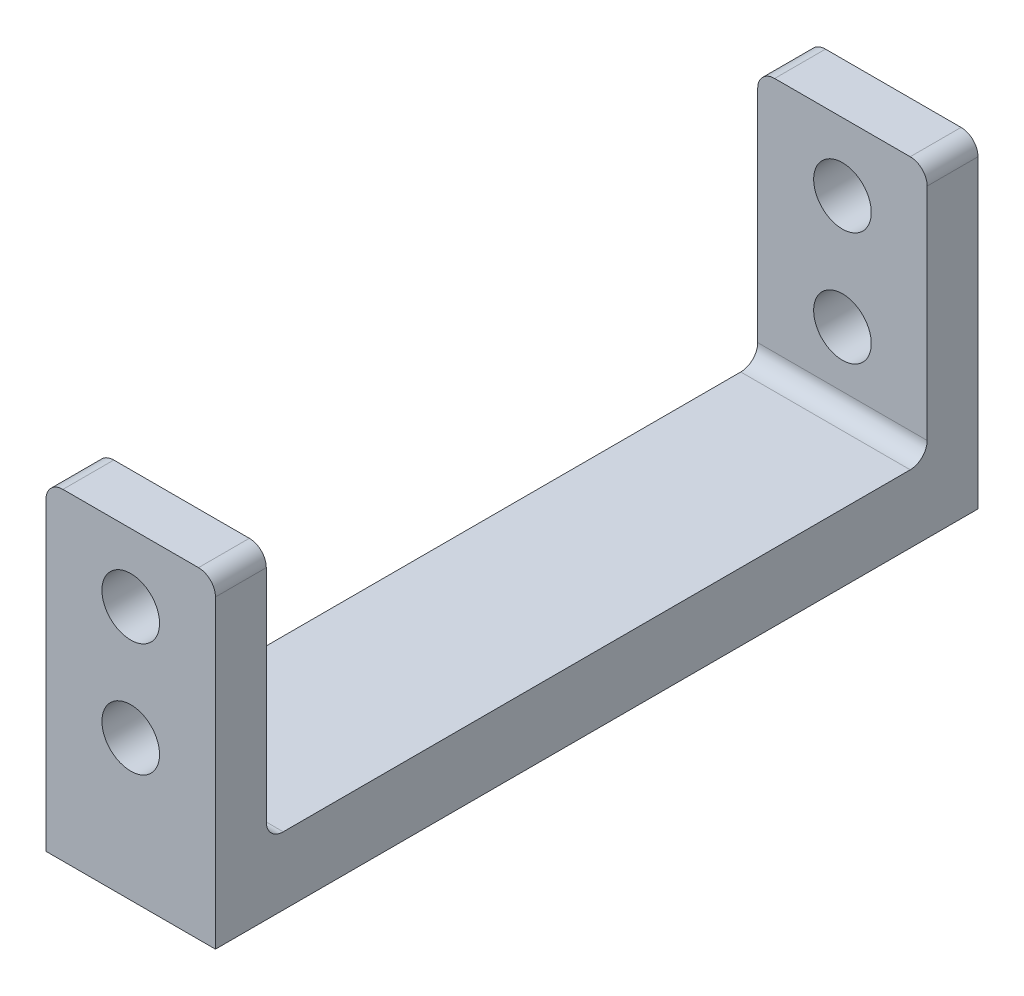
ISO-10303-21;
HEADER;
FILE_DESCRIPTION(('STEP AP214'),'2;1');
FILE_NAME('part.step','',(''),(''),'','','');
FILE_SCHEMA(('AUTOMOTIVE_DESIGN { 1 0 10303 214 1 1 1 1 }'));
ENDSEC;
DATA;
#1=APPLICATION_CONTEXT('core data for automotive mechanical design processes');
#2=APPLICATION_PROTOCOL_DEFINITION('international standard','automotive_design',2000,#1);
#3=PRODUCT_CONTEXT('',#1,'mechanical');
#4=PRODUCT('Part','Part','',(#3));
#5=PRODUCT_RELATED_PRODUCT_CATEGORY('part','',(#4));
#6=PRODUCT_DEFINITION_FORMATION('','',#4);
#7=PRODUCT_DEFINITION_CONTEXT('part definition',#1,'design');
#8=PRODUCT_DEFINITION('design','',#6,#7);
#9=PRODUCT_DEFINITION_SHAPE('','',#8);
#10=(LENGTH_UNIT() NAMED_UNIT(*) SI_UNIT(.MILLI.,.METRE.));
#11=(NAMED_UNIT(*) PLANE_ANGLE_UNIT() SI_UNIT($,.RADIAN.));
#12=(NAMED_UNIT(*) SI_UNIT($,.STERADIAN.) SOLID_ANGLE_UNIT());
#13=UNCERTAINTY_MEASURE_WITH_UNIT(LENGTH_MEASURE(1.E-05),#10,'distance_accuracy_value','');
#14=(GEOMETRIC_REPRESENTATION_CONTEXT(3) GLOBAL_UNCERTAINTY_ASSIGNED_CONTEXT((#13)) GLOBAL_UNIT_ASSIGNED_CONTEXT((#10,
#11,#12)) REPRESENTATION_CONTEXT('',''));
#15=CARTESIAN_POINT('',(0.,0.,0.));
#16=DIRECTION('',(0.,0.,1.));
#17=DIRECTION('',(1.,0.,0.));
#18=AXIS2_PLACEMENT_3D('',#15,#16,#17);
#19=CARTESIAN_POINT('',(5.,4.,22.5));
#20=DIRECTION('',(0.,0.,-1.));
#21=DIRECTION('',(-1.,0.,0.));
#22=AXIS2_PLACEMENT_3D('',#19,#20,#21);
#23=PLANE('',#22);
#24=CARTESIAN_POINT('',(0.,8.3,22.5));
#25=DIRECTION('',(0.,0.,1.));
#26=DIRECTION('',(1.,0.,0.));
#27=AXIS2_PLACEMENT_3D('',#24,#25,#26);
#28=CIRCLE('',#27,1.7);
#29=CARTESIAN_POINT('',(1.7,8.3,22.5));
#30=VERTEX_POINT('',#29);
#31=EDGE_CURVE('E542',#30,#30,#28,.T.);
#32=ORIENTED_EDGE('',*,*,#31,.F.);
#33=EDGE_LOOP('',(#32));
#34=FACE_BOUND('',#33,.T.);
#35=DIRECTION('',(0.,-1.,0.));
#36=VECTOR('',#35,1.);
#37=CARTESIAN_POINT('',(5.,4.,22.5));
#38=LINE('',#37,#36);
#39=CARTESIAN_POINT('',(5.,18.,22.5));
#40=VERTEX_POINT('',#39);
#41=CARTESIAN_POINT('',(5.,0.,22.5));
#42=VERTEX_POINT('',#41);
#43=EDGE_CURVE('E162',#40,#42,#38,.T.);
#44=ORIENTED_EDGE('',*,*,#43,.F.);
#45=CARTESIAN_POINT('',(4.,18.,22.5));
#46=DIRECTION('',(0.,0.,-1.));
#47=DIRECTION('',(-1.,0.,0.));
#48=AXIS2_PLACEMENT_3D('',#45,#46,#47);
#49=CIRCLE('',#48,1.);
#50=CARTESIAN_POINT('',(4.,19.,22.5));
#51=VERTEX_POINT('',#50);
#52=EDGE_CURVE('E241',#40,#51,#49,.F.);
#53=ORIENTED_EDGE('',*,*,#52,.T.);
#54=DIRECTION('',(1.,0.,0.));
#55=VECTOR('',#54,1.);
#56=CARTESIAN_POINT('',(-5.,19.,22.5));
#57=LINE('',#56,#55);
#58=CARTESIAN_POINT('',(-4.,19.,22.5));
#59=VERTEX_POINT('',#58);
#60=EDGE_CURVE('E303',#59,#51,#57,.T.);
#61=ORIENTED_EDGE('',*,*,#60,.F.);
#62=CARTESIAN_POINT('',(-4.,18.,22.5));
#63=DIRECTION('',(0.,0.,-1.));
#64=DIRECTION('',(-1.,0.,0.));
#65=AXIS2_PLACEMENT_3D('',#62,#63,#64);
#66=CIRCLE('',#65,1.);
#67=CARTESIAN_POINT('',(-5.,18.,22.5));
#68=VERTEX_POINT('',#67);
#69=EDGE_CURVE('E156',#59,#68,#66,.F.);
#70=ORIENTED_EDGE('',*,*,#69,.T.);
#71=DIRECTION('',(0.,-1.,0.));
#72=VECTOR('',#71,1.);
#73=CARTESIAN_POINT('',(-5.,4.,22.5));
#74=LINE('',#73,#72);
#75=CARTESIAN_POINT('',(-5.,0.,22.5));
#76=VERTEX_POINT('',#75);
#77=EDGE_CURVE('E149',#68,#76,#74,.T.);
#78=ORIENTED_EDGE('',*,*,#77,.T.);
#79=DIRECTION('',(1.,0.,0.));
#80=VECTOR('',#79,1.);
#81=CARTESIAN_POINT('',(5.,0.,22.5));
#82=LINE('',#81,#80);
#83=EDGE_CURVE('E153',#76,#42,#82,.T.);
#84=ORIENTED_EDGE('',*,*,#83,.T.);
#85=EDGE_LOOP('',(#44,#53,#61,#70,#78,#84));
#86=FACE_BOUND('',#85,.T.);
#87=CARTESIAN_POINT('',(0.,15.,22.5));
#88=DIRECTION('',(0.,0.,1.));
#89=DIRECTION('',(1.,0.,0.));
#90=AXIS2_PLACEMENT_3D('',#87,#88,#89);
#91=CIRCLE('',#90,1.7);
#92=CARTESIAN_POINT('',(1.7,15.,22.5));
#93=VERTEX_POINT('',#92);
#94=EDGE_CURVE('E549',#93,#93,#91,.T.);
#95=ORIENTED_EDGE('',*,*,#94,.F.);
#96=EDGE_LOOP('',(#95));
#97=FACE_BOUND('',#96,.T.);
#98=ADVANCED_FACE('F45',(#34,#86,#97),#23,.F.);
#99=CARTESIAN_POINT('',(0.,4.,0.));
#100=DIRECTION('',(0.,-1.,0.));
#101=DIRECTION('',(0.,0.,-1.));
#102=AXIS2_PLACEMENT_3D('',#99,#100,#101);
#103=PLANE('',#102);
#104=DIRECTION('',(0.,0.,1.));
#105=VECTOR('',#104,1.);
#106=CARTESIAN_POINT('',(-5.,4.,-22.5));
#107=LINE('',#106,#105);
#108=CARTESIAN_POINT('',(-5.,4.,-18.5));
#109=VERTEX_POINT('',#108);
#110=CARTESIAN_POINT('',(-5.,4.,18.5));
#111=VERTEX_POINT('',#110);
#112=EDGE_CURVE('E192',#109,#111,#107,.T.);
#113=ORIENTED_EDGE('',*,*,#112,.T.);
#114=DIRECTION('',(-1.,0.,0.));
#115=VECTOR('',#114,1.);
#116=CARTESIAN_POINT('',(5.,4.,18.5));
#117=LINE('',#116,#115);
#118=CARTESIAN_POINT('',(5.,4.,18.5));
#119=VERTEX_POINT('',#118);
#120=EDGE_CURVE('E212',#111,#119,#117,.F.);
#121=ORIENTED_EDGE('',*,*,#120,.T.);
#122=DIRECTION('',(0.,0.,-1.));
#123=VECTOR('',#122,1.);
#124=CARTESIAN_POINT('',(5.,4.,-22.5));
#125=LINE('',#124,#123);
#126=CARTESIAN_POINT('',(5.,4.,-18.5));
#127=VERTEX_POINT('',#126);
#128=EDGE_CURVE('E184',#119,#127,#125,.T.);
#129=ORIENTED_EDGE('',*,*,#128,.T.);
#130=DIRECTION('',(1.,0.,0.));
#131=VECTOR('',#130,1.);
#132=CARTESIAN_POINT('',(-5.,4.,-18.5));
#133=LINE('',#132,#131);
#134=EDGE_CURVE('E209',#127,#109,#133,.F.);
#135=ORIENTED_EDGE('',*,*,#134,.T.);
#136=EDGE_LOOP('',(#113,#121,#129,#135));
#137=FACE_BOUND('',#136,.T.);
#138=ADVANCED_FACE('F280',(#137),#103,.F.);
#139=CARTESIAN_POINT('',(-5.,4.,-22.5));
#140=DIRECTION('',(1.,0.,0.));
#141=DIRECTION('',(0.,0.,-1.));
#142=AXIS2_PLACEMENT_3D('',#139,#140,#141);
#143=PLANE('',#142);
#144=ORIENTED_EDGE('',*,*,#77,.F.);
#145=DIRECTION('',(0.,0.,1.));
#146=VECTOR('',#145,1.);
#147=CARTESIAN_POINT('',(-5.,18.,19.5));
#148=LINE('',#147,#146);
#149=CARTESIAN_POINT('',(-5.,18.,19.5));
#150=VERTEX_POINT('',#149);
#151=EDGE_CURVE('E247',#68,#150,#148,.F.);
#152=ORIENTED_EDGE('',*,*,#151,.T.);
#153=DIRECTION('',(0.,-1.,0.));
#154=VECTOR('',#153,1.);
#155=CARTESIAN_POINT('',(-5.,19.,19.5));
#156=LINE('',#155,#154);
#157=CARTESIAN_POINT('',(-5.,5.,19.5));
#158=VERTEX_POINT('',#157);
#159=EDGE_CURVE('E311',#150,#158,#156,.T.);
#160=ORIENTED_EDGE('',*,*,#159,.T.);
#161=CARTESIAN_POINT('',(-5.,5.,18.5));
#162=DIRECTION('',(1.,0.,0.));
#163=DIRECTION('',(0.,0.,-1.));
#164=AXIS2_PLACEMENT_3D('',#161,#162,#163);
#165=CIRCLE('',#164,1.);
#166=EDGE_CURVE('E261',#158,#111,#165,.T.);
#167=ORIENTED_EDGE('',*,*,#166,.T.);
#168=ORIENTED_EDGE('',*,*,#112,.F.);
#169=CARTESIAN_POINT('',(-5.,5.,-18.5));
#170=DIRECTION('',(1.,0.,0.));
#171=DIRECTION('',(0.,0.,-1.));
#172=AXIS2_PLACEMENT_3D('',#169,#170,#171);
#173=CIRCLE('',#172,1.);
#174=CARTESIAN_POINT('',(-5.,5.,-19.5));
#175=VERTEX_POINT('',#174);
#176=EDGE_CURVE('E11',#109,#175,#173,.T.);
#177=ORIENTED_EDGE('',*,*,#176,.T.);
#178=DIRECTION('',(0.,-1.,0.));
#179=VECTOR('',#178,1.);
#180=CARTESIAN_POINT('',(-5.,19.,-19.5));
#181=LINE('',#180,#179);
#182=CARTESIAN_POINT('',(-5.,18.,-19.5));
#183=VERTEX_POINT('',#182);
#184=EDGE_CURVE('E177',#183,#175,#181,.T.);
#185=ORIENTED_EDGE('',*,*,#184,.F.);
#186=DIRECTION('',(0.,0.,1.));
#187=VECTOR('',#186,1.);
#188=CARTESIAN_POINT('',(-5.,18.,-22.5));
#189=LINE('',#188,#187);
#190=CARTESIAN_POINT('',(-5.,18.,-22.5));
#191=VERTEX_POINT('',#190);
#192=EDGE_CURVE('E244',#183,#191,#189,.F.);
#193=ORIENTED_EDGE('',*,*,#192,.T.);
#194=DIRECTION('',(0.,-1.,0.));
#195=VECTOR('',#194,1.);
#196=CARTESIAN_POINT('',(-5.,4.,-22.5));
#197=LINE('',#196,#195);
#198=CARTESIAN_POINT('',(-5.,0.,-22.5));
#199=VERTEX_POINT('',#198);
#200=EDGE_CURVE('E174',#191,#199,#197,.T.);
#201=ORIENTED_EDGE('',*,*,#200,.T.);
#202=DIRECTION('',(0.,0.,1.));
#203=VECTOR('',#202,1.);
#204=CARTESIAN_POINT('',(-5.,0.,-22.5));
#205=LINE('',#204,#203);
#206=EDGE_CURVE('E168',#199,#76,#205,.T.);
#207=ORIENTED_EDGE('',*,*,#206,.T.);
#208=EDGE_LOOP('',(#144,#152,#160,#167,#168,#177,#185,#193,#201,#207));
#209=FACE_BOUND('',#208,.T.);
#210=ADVANCED_FACE('F173',(#209),#143,.F.);
#211=CARTESIAN_POINT('',(5.,4.,-22.5));
#212=DIRECTION('',(-1.,0.,0.));
#213=DIRECTION('',(0.,0.,1.));
#214=AXIS2_PLACEMENT_3D('',#211,#212,#213);
#215=PLANE('',#214);
#216=DIRECTION('',(0.,-1.,0.));
#217=VECTOR('',#216,1.);
#218=CARTESIAN_POINT('',(5.,19.,19.5));
#219=LINE('',#218,#217);
#220=CARTESIAN_POINT('',(5.,18.,19.5));
#221=VERTEX_POINT('',#220);
#222=CARTESIAN_POINT('',(5.,5.,19.5));
#223=VERTEX_POINT('',#222);
#224=EDGE_CURVE('E307',#221,#223,#219,.T.);
#225=ORIENTED_EDGE('',*,*,#224,.F.);
#226=DIRECTION('',(0.,0.,-1.));
#227=VECTOR('',#226,1.);
#228=CARTESIAN_POINT('',(5.,18.,22.5));
#229=LINE('',#228,#227);
#230=EDGE_CURVE('E236',#221,#40,#229,.F.);
#231=ORIENTED_EDGE('',*,*,#230,.T.);
#232=ORIENTED_EDGE('',*,*,#43,.T.);
#233=DIRECTION('',(0.,0.,-1.));
#234=VECTOR('',#233,1.);
#235=CARTESIAN_POINT('',(5.,0.,-22.5));
#236=LINE('',#235,#234);
#237=CARTESIAN_POINT('',(5.,0.,-22.5));
#238=VERTEX_POINT('',#237);
#239=EDGE_CURVE('E170',#42,#238,#236,.T.);
#240=ORIENTED_EDGE('',*,*,#239,.T.);
#241=DIRECTION('',(0.,-1.,0.));
#242=VECTOR('',#241,1.);
#243=CARTESIAN_POINT('',(5.,4.,-22.5));
#244=LINE('',#243,#242);
#245=CARTESIAN_POINT('',(5.,18.,-22.5));
#246=VERTEX_POINT('',#245);
#247=EDGE_CURVE('E195',#246,#238,#244,.T.);
#248=ORIENTED_EDGE('',*,*,#247,.F.);
#249=DIRECTION('',(0.,0.,-1.));
#250=VECTOR('',#249,1.);
#251=CARTESIAN_POINT('',(5.,18.,-19.5));
#252=LINE('',#251,#250);
#253=CARTESIAN_POINT('',(5.,18.,-19.5));
#254=VERTEX_POINT('',#253);
#255=EDGE_CURVE('E233',#246,#254,#252,.F.);
#256=ORIENTED_EDGE('',*,*,#255,.T.);
#257=DIRECTION('',(0.,-1.,0.));
#258=VECTOR('',#257,1.);
#259=CARTESIAN_POINT('',(5.,19.,-19.5));
#260=LINE('',#259,#258);
#261=CARTESIAN_POINT('',(5.,5.,-19.5));
#262=VERTEX_POINT('',#261);
#263=EDGE_CURVE('E181',#254,#262,#260,.T.);
#264=ORIENTED_EDGE('',*,*,#263,.T.);
#265=CARTESIAN_POINT('',(5.,5.,-18.5));
#266=DIRECTION('',(-1.,0.,0.));
#267=DIRECTION('',(0.,0.,1.));
#268=AXIS2_PLACEMENT_3D('',#265,#266,#267);
#269=CIRCLE('',#268,1.);
#270=EDGE_CURVE('E54',#262,#127,#269,.T.);
#271=ORIENTED_EDGE('',*,*,#270,.T.);
#272=ORIENTED_EDGE('',*,*,#128,.F.);
#273=CARTESIAN_POINT('',(5.,5.,18.5));
#274=DIRECTION('',(-1.,0.,0.));
#275=DIRECTION('',(0.,0.,1.));
#276=AXIS2_PLACEMENT_3D('',#273,#274,#275);
#277=CIRCLE('',#276,1.);
#278=EDGE_CURVE('E264',#119,#223,#277,.T.);
#279=ORIENTED_EDGE('',*,*,#278,.T.);
#280=EDGE_LOOP('',(#225,#231,#232,#240,#248,#256,#264,#271,#272,#279));
#281=FACE_BOUND('',#280,.T.);
#282=ADVANCED_FACE('F272',(#281),#215,.F.);
#283=CARTESIAN_POINT('',(5.,4.,-22.5));
#284=DIRECTION('',(0.,0.,1.));
#285=DIRECTION('',(1.,0.,0.));
#286=AXIS2_PLACEMENT_3D('',#283,#284,#285);
#287=PLANE('',#286);
#288=CARTESIAN_POINT('',(0.,15.,-22.5));
#289=DIRECTION('',(0.,0.,-1.));
#290=DIRECTION('',(-1.,0.,0.));
#291=AXIS2_PLACEMENT_3D('',#288,#289,#290);
#292=CIRCLE('',#291,1.7);
#293=CARTESIAN_POINT('',(-1.7,15.,-22.5));
#294=VERTEX_POINT('',#293);
#295=EDGE_CURVE('E565',#294,#294,#292,.T.);
#296=ORIENTED_EDGE('',*,*,#295,.F.);
#297=EDGE_LOOP('',(#296));
#298=FACE_BOUND('',#297,.T.);
#299=CARTESIAN_POINT('',(0.,8.3,-22.5));
#300=DIRECTION('',(0.,0.,-1.));
#301=DIRECTION('',(-1.,0.,0.));
#302=AXIS2_PLACEMENT_3D('',#299,#300,#301);
#303=CIRCLE('',#302,1.7);
#304=CARTESIAN_POINT('',(-1.7,8.3,-22.5));
#305=VERTEX_POINT('',#304);
#306=EDGE_CURVE('E557',#305,#305,#303,.T.);
#307=ORIENTED_EDGE('',*,*,#306,.F.);
#308=EDGE_LOOP('',(#307));
#309=FACE_BOUND('',#308,.T.);
#310=DIRECTION('',(-1.,0.,0.));
#311=VECTOR('',#310,1.);
#312=CARTESIAN_POINT('',(-5.,19.,-22.5));
#313=LINE('',#312,#311);
#314=CARTESIAN_POINT('',(4.,19.,-22.5));
#315=VERTEX_POINT('',#314);
#316=CARTESIAN_POINT('',(-4.,19.,-22.5));
#317=VERTEX_POINT('',#316);
#318=EDGE_CURVE('E297',#315,#317,#313,.T.);
#319=ORIENTED_EDGE('',*,*,#318,.F.);
#320=CARTESIAN_POINT('',(4.,18.,-22.5));
#321=DIRECTION('',(0.,0.,1.));
#322=DIRECTION('',(1.,0.,0.));
#323=AXIS2_PLACEMENT_3D('',#320,#321,#322);
#324=CIRCLE('',#323,1.);
#325=EDGE_CURVE('E69',#315,#246,#324,.F.);
#326=ORIENTED_EDGE('',*,*,#325,.T.);
#327=ORIENTED_EDGE('',*,*,#247,.T.);
#328=DIRECTION('',(-1.,0.,0.));
#329=VECTOR('',#328,1.);
#330=CARTESIAN_POINT('',(5.,0.,-22.5));
#331=LINE('',#330,#329);
#332=EDGE_CURVE('E189',#238,#199,#331,.T.);
#333=ORIENTED_EDGE('',*,*,#332,.T.);
#334=ORIENTED_EDGE('',*,*,#200,.F.);
#335=CARTESIAN_POINT('',(-4.,18.,-22.5));
#336=DIRECTION('',(0.,0.,1.));
#337=DIRECTION('',(1.,0.,0.));
#338=AXIS2_PLACEMENT_3D('',#335,#336,#337);
#339=CIRCLE('',#338,1.);
#340=EDGE_CURVE('E61',#191,#317,#339,.F.);
#341=ORIENTED_EDGE('',*,*,#340,.T.);
#342=EDGE_LOOP('',(#319,#326,#327,#333,#334,#341));
#343=FACE_BOUND('',#342,.T.);
#344=ADVANCED_FACE('F339',(#298,#309,#343),#287,.F.);
#345=CARTESIAN_POINT('',(0.,0.,0.));
#346=DIRECTION('',(0.,-1.,0.));
#347=DIRECTION('',(0.,0.,-1.));
#348=AXIS2_PLACEMENT_3D('',#345,#346,#347);
#349=PLANE('',#348);
#350=ORIENTED_EDGE('',*,*,#206,.F.);
#351=ORIENTED_EDGE('',*,*,#332,.F.);
#352=ORIENTED_EDGE('',*,*,#239,.F.);
#353=ORIENTED_EDGE('',*,*,#83,.F.);
#354=EDGE_LOOP('',(#350,#351,#352,#353));
#355=FACE_BOUND('',#354,.T.);
#356=ADVANCED_FACE('F166',(#355),#349,.T.);
#357=CARTESIAN_POINT('',(-5.,19.,19.5));
#358=DIRECTION('',(0.,0.,1.));
#359=DIRECTION('',(1.,0.,0.));
#360=AXIS2_PLACEMENT_3D('',#357,#358,#359);
#361=PLANE('',#360);
#362=CARTESIAN_POINT('',(0.,15.,19.5));
#363=DIRECTION('',(0.,0.,1.));
#364=DIRECTION('',(1.,0.,0.));
#365=AXIS2_PLACEMENT_3D('',#362,#363,#364);
#366=CIRCLE('',#365,1.7);
#367=CARTESIAN_POINT('',(1.7,15.,19.5));
#368=VERTEX_POINT('',#367);
#369=EDGE_CURVE('E538',#368,#368,#366,.T.);
#370=ORIENTED_EDGE('',*,*,#369,.T.);
#371=EDGE_LOOP('',(#370));
#372=FACE_BOUND('',#371,.T.);
#373=CARTESIAN_POINT('',(0.,8.3,19.5));
#374=DIRECTION('',(0.,0.,1.));
#375=DIRECTION('',(1.,0.,0.));
#376=AXIS2_PLACEMENT_3D('',#373,#374,#375);
#377=CIRCLE('',#376,1.7);
#378=CARTESIAN_POINT('',(1.7,8.3,19.5));
#379=VERTEX_POINT('',#378);
#380=EDGE_CURVE('E312',#379,#379,#377,.T.);
#381=ORIENTED_EDGE('',*,*,#380,.T.);
#382=EDGE_LOOP('',(#381));
#383=FACE_BOUND('',#382,.T.);
#384=ORIENTED_EDGE('',*,*,#224,.T.);
#385=DIRECTION('',(-1.,0.,0.));
#386=VECTOR('',#385,1.);
#387=CARTESIAN_POINT('',(-5.,5.,19.5));
#388=LINE('',#387,#386);
#389=EDGE_CURVE('E205',#223,#158,#388,.T.);
#390=ORIENTED_EDGE('',*,*,#389,.T.);
#391=ORIENTED_EDGE('',*,*,#159,.F.);
#392=CARTESIAN_POINT('',(-4.,18.,19.5));
#393=DIRECTION('',(0.,0.,1.));
#394=DIRECTION('',(1.,0.,0.));
#395=AXIS2_PLACEMENT_3D('',#392,#393,#394);
#396=CIRCLE('',#395,1.);
#397=CARTESIAN_POINT('',(-4.,19.,19.5));
#398=VERTEX_POINT('',#397);
#399=EDGE_CURVE('E161',#150,#398,#396,.F.);
#400=ORIENTED_EDGE('',*,*,#399,.T.);
#401=DIRECTION('',(-1.,0.,0.));
#402=VECTOR('',#401,1.);
#403=CARTESIAN_POINT('',(-5.,19.,19.5));
#404=LINE('',#403,#402);
#405=CARTESIAN_POINT('',(4.,19.,19.5));
#406=VERTEX_POINT('',#405);
#407=EDGE_CURVE('E316',#406,#398,#404,.T.);
#408=ORIENTED_EDGE('',*,*,#407,.F.);
#409=CARTESIAN_POINT('',(4.,18.,19.5));
#410=DIRECTION('',(0.,0.,1.));
#411=DIRECTION('',(1.,0.,0.));
#412=AXIS2_PLACEMENT_3D('',#409,#410,#411);
#413=CIRCLE('',#412,1.);
#414=EDGE_CURVE('E202',#406,#221,#413,.F.);
#415=ORIENTED_EDGE('',*,*,#414,.T.);
#416=EDGE_LOOP('',(#384,#390,#391,#400,#408,#415));
#417=FACE_BOUND('',#416,.T.);
#418=ADVANCED_FACE('F328',(#372,#383,#417),#361,.F.);
#419=CARTESIAN_POINT('',(0.,19.,0.));
#420=DIRECTION('',(0.,1.,0.));
#421=DIRECTION('',(0.,0.,1.));
#422=AXIS2_PLACEMENT_3D('',#419,#420,#421);
#423=PLANE('',#422);
#424=ORIENTED_EDGE('',*,*,#60,.T.);
#425=DIRECTION('',(0.,0.,-1.));
#426=VECTOR('',#425,1.);
#427=CARTESIAN_POINT('',(4.,19.,19.5));
#428=LINE('',#427,#426);
#429=EDGE_CURVE('E229',#51,#406,#428,.T.);
#430=ORIENTED_EDGE('',*,*,#429,.T.);
#431=ORIENTED_EDGE('',*,*,#407,.T.);
#432=DIRECTION('',(0.,0.,1.));
#433=VECTOR('',#432,1.);
#434=CARTESIAN_POINT('',(-4.,19.,22.5));
#435=LINE('',#434,#433);
#436=EDGE_CURVE('E225',#398,#59,#435,.T.);
#437=ORIENTED_EDGE('',*,*,#436,.T.);
#438=EDGE_LOOP('',(#424,#430,#431,#437));
#439=FACE_BOUND('',#438,.T.);
#440=ADVANCED_FACE('F336',(#439),#423,.T.);
#441=CARTESIAN_POINT('',(-5.,19.,-19.5));
#442=DIRECTION('',(0.,0.,-1.));
#443=DIRECTION('',(-1.,0.,0.));
#444=AXIS2_PLACEMENT_3D('',#441,#442,#443);
#445=PLANE('',#444);
#446=CARTESIAN_POINT('',(0.,15.,-19.5));
#447=DIRECTION('',(0.,0.,-1.));
#448=DIRECTION('',(-1.,0.,0.));
#449=AXIS2_PLACEMENT_3D('',#446,#447,#448);
#450=CIRCLE('',#449,1.7);
#451=CARTESIAN_POINT('',(-1.7,15.,-19.5));
#452=VERTEX_POINT('',#451);
#453=EDGE_CURVE('E561',#452,#452,#450,.T.);
#454=ORIENTED_EDGE('',*,*,#453,.T.);
#455=EDGE_LOOP('',(#454));
#456=FACE_BOUND('',#455,.T.);
#457=CARTESIAN_POINT('',(0.,8.3,-19.5));
#458=DIRECTION('',(0.,0.,-1.));
#459=DIRECTION('',(-1.,0.,0.));
#460=AXIS2_PLACEMENT_3D('',#457,#458,#459);
#461=CIRCLE('',#460,1.7);
#462=CARTESIAN_POINT('',(-1.7,8.3,-19.5));
#463=VERTEX_POINT('',#462);
#464=EDGE_CURVE('E553',#463,#463,#461,.T.);
#465=ORIENTED_EDGE('',*,*,#464,.T.);
#466=EDGE_LOOP('',(#465));
#467=FACE_BOUND('',#466,.T.);
#468=ORIENTED_EDGE('',*,*,#184,.T.);
#469=DIRECTION('',(1.,0.,0.));
#470=VECTOR('',#469,1.);
#471=CARTESIAN_POINT('',(5.,5.,-19.5));
#472=LINE('',#471,#470);
#473=EDGE_CURVE('E221',#175,#262,#472,.T.);
#474=ORIENTED_EDGE('',*,*,#473,.T.);
#475=ORIENTED_EDGE('',*,*,#263,.F.);
#476=CARTESIAN_POINT('',(4.,18.,-19.5));
#477=DIRECTION('',(0.,0.,-1.));
#478=DIRECTION('',(-1.,0.,0.));
#479=AXIS2_PLACEMENT_3D('',#476,#477,#478);
#480=CIRCLE('',#479,1.);
#481=CARTESIAN_POINT('',(3.99999999999999,19.,-19.5));
#482=VERTEX_POINT('',#481);
#483=EDGE_CURVE('E218',#254,#482,#480,.F.);
#484=ORIENTED_EDGE('',*,*,#483,.T.);
#485=DIRECTION('',(1.,0.,0.));
#486=VECTOR('',#485,1.);
#487=CARTESIAN_POINT('',(-5.,19.,-19.5));
#488=LINE('',#487,#486);
#489=CARTESIAN_POINT('',(-4.,19.,-19.5));
#490=VERTEX_POINT('',#489);
#491=EDGE_CURVE('E292',#490,#482,#488,.T.);
#492=ORIENTED_EDGE('',*,*,#491,.F.);
#493=CARTESIAN_POINT('',(-4.,18.,-19.5));
#494=DIRECTION('',(0.,0.,-1.));
#495=DIRECTION('',(-1.,0.,0.));
#496=AXIS2_PLACEMENT_3D('',#493,#494,#495);
#497=CIRCLE('',#496,1.);
#498=EDGE_CURVE('E215',#490,#183,#497,.F.);
#499=ORIENTED_EDGE('',*,*,#498,.T.);
#500=EDGE_LOOP('',(#468,#474,#475,#484,#492,#499));
#501=FACE_BOUND('',#500,.T.);
#502=ADVANCED_FACE('F289',(#456,#467,#501),#445,.F.);
#503=CARTESIAN_POINT('',(0.,19.,0.));
#504=DIRECTION('',(0.,1.,0.));
#505=DIRECTION('',(0.,0.,1.));
#506=AXIS2_PLACEMENT_3D('',#503,#504,#505);
#507=PLANE('',#506);
#508=ORIENTED_EDGE('',*,*,#491,.T.);
#509=DIRECTION('',(0.,0.,-1.));
#510=VECTOR('',#509,1.);
#511=CARTESIAN_POINT('',(4.,19.,-22.5));
#512=LINE('',#511,#510);
#513=EDGE_CURVE('E254',#482,#315,#512,.T.);
#514=ORIENTED_EDGE('',*,*,#513,.T.);
#515=ORIENTED_EDGE('',*,*,#318,.T.);
#516=DIRECTION('',(0.,0.,1.));
#517=VECTOR('',#516,1.);
#518=CARTESIAN_POINT('',(-4.,19.,-19.5));
#519=LINE('',#518,#517);
#520=EDGE_CURVE('E250',#317,#490,#519,.T.);
#521=ORIENTED_EDGE('',*,*,#520,.T.);
#522=EDGE_LOOP('',(#508,#514,#515,#521));
#523=FACE_BOUND('',#522,.T.);
#524=ADVANCED_FACE('F296',(#523),#507,.T.);
#525=CARTESIAN_POINT('',(0.,8.3,22.5));
#526=DIRECTION('',(0.,0.,1.));
#527=DIRECTION('',(1.,0.,0.));
#528=AXIS2_PLACEMENT_3D('',#525,#526,#527);
#529=CYLINDRICAL_SURFACE('',#528,1.7);
#530=ORIENTED_EDGE('',*,*,#380,.F.);
#531=EDGE_LOOP('',(#530));
#532=FACE_BOUND('',#531,.T.);
#533=ORIENTED_EDGE('',*,*,#31,.T.);
#534=EDGE_LOOP('',(#533));
#535=FACE_BOUND('',#534,.T.);
#536=ADVANCED_FACE('F440',(#532,#535),#529,.F.);
#537=CARTESIAN_POINT('',(0.,15.,22.5));
#538=DIRECTION('',(0.,0.,1.));
#539=DIRECTION('',(1.,0.,0.));
#540=AXIS2_PLACEMENT_3D('',#537,#538,#539);
#541=CYLINDRICAL_SURFACE('',#540,1.7);
#542=ORIENTED_EDGE('',*,*,#369,.F.);
#543=EDGE_LOOP('',(#542));
#544=FACE_BOUND('',#543,.T.);
#545=ORIENTED_EDGE('',*,*,#94,.T.);
#546=EDGE_LOOP('',(#545));
#547=FACE_BOUND('',#546,.T.);
#548=ADVANCED_FACE('F430',(#544,#547),#541,.F.);
#549=CARTESIAN_POINT('',(0.,8.3,-22.5));
#550=DIRECTION('',(0.,0.,-1.));
#551=DIRECTION('',(-1.,0.,0.));
#552=AXIS2_PLACEMENT_3D('',#549,#550,#551);
#553=CYLINDRICAL_SURFACE('',#552,1.7);
#554=ORIENTED_EDGE('',*,*,#464,.F.);
#555=EDGE_LOOP('',(#554));
#556=FACE_BOUND('',#555,.T.);
#557=ORIENTED_EDGE('',*,*,#306,.T.);
#558=EDGE_LOOP('',(#557));
#559=FACE_BOUND('',#558,.T.);
#560=ADVANCED_FACE('F420',(#556,#559),#553,.F.);
#561=CARTESIAN_POINT('',(0.,15.,-22.5));
#562=DIRECTION('',(0.,0.,-1.));
#563=DIRECTION('',(-1.,0.,0.));
#564=AXIS2_PLACEMENT_3D('',#561,#562,#563);
#565=CYLINDRICAL_SURFACE('',#564,1.7);
#566=ORIENTED_EDGE('',*,*,#453,.F.);
#567=EDGE_LOOP('',(#566));
#568=FACE_BOUND('',#567,.T.);
#569=ORIENTED_EDGE('',*,*,#295,.T.);
#570=EDGE_LOOP('',(#569));
#571=FACE_BOUND('',#570,.T.);
#572=ADVANCED_FACE('F366',(#568,#571),#565,.F.);
#573=CARTESIAN_POINT('',(-5.,5.,18.5));
#574=DIRECTION('',(1.,0.,0.));
#575=DIRECTION('',(0.,0.,-1.));
#576=AXIS2_PLACEMENT_3D('',#573,#574,#575);
#577=CYLINDRICAL_SURFACE('',#576,1.);
#578=ORIENTED_EDGE('',*,*,#278,.F.);
#579=ORIENTED_EDGE('',*,*,#120,.F.);
#580=ORIENTED_EDGE('',*,*,#166,.F.);
#581=ORIENTED_EDGE('',*,*,#389,.F.);
#582=EDGE_LOOP('',(#578,#579,#580,#581));
#583=FACE_BOUND('',#582,.T.);
#584=ADVANCED_FACE('F324',(#583),#577,.F.);
#585=CARTESIAN_POINT('',(-5.,5.,-18.5));
#586=DIRECTION('',(-1.,0.,0.));
#587=DIRECTION('',(0.,0.,1.));
#588=AXIS2_PLACEMENT_3D('',#585,#586,#587);
#589=CYLINDRICAL_SURFACE('',#588,1.);
#590=ORIENTED_EDGE('',*,*,#176,.F.);
#591=ORIENTED_EDGE('',*,*,#134,.F.);
#592=ORIENTED_EDGE('',*,*,#270,.F.);
#593=ORIENTED_EDGE('',*,*,#473,.F.);
#594=EDGE_LOOP('',(#590,#591,#592,#593));
#595=FACE_BOUND('',#594,.T.);
#596=ADVANCED_FACE('F285',(#595),#589,.F.);
#597=CARTESIAN_POINT('',(4.,18.,0.));
#598=DIRECTION('',(0.,0.,1.));
#599=DIRECTION('',(1.,0.,0.));
#600=AXIS2_PLACEMENT_3D('',#597,#598,#599);
#601=CYLINDRICAL_SURFACE('',#600,1.);
#602=ORIENTED_EDGE('',*,*,#52,.F.);
#603=ORIENTED_EDGE('',*,*,#230,.F.);
#604=ORIENTED_EDGE('',*,*,#414,.F.);
#605=ORIENTED_EDGE('',*,*,#429,.F.);
#606=EDGE_LOOP('',(#602,#603,#604,#605));
#607=FACE_BOUND('',#606,.T.);
#608=ADVANCED_FACE('F334',(#607),#601,.T.);
#609=CARTESIAN_POINT('',(-4.,18.,0.));
#610=DIRECTION('',(0.,0.,-1.));
#611=DIRECTION('',(-1.,0.,0.));
#612=AXIS2_PLACEMENT_3D('',#609,#610,#611);
#613=CYLINDRICAL_SURFACE('',#612,1.);
#614=ORIENTED_EDGE('',*,*,#399,.F.);
#615=ORIENTED_EDGE('',*,*,#151,.F.);
#616=ORIENTED_EDGE('',*,*,#69,.F.);
#617=ORIENTED_EDGE('',*,*,#436,.F.);
#618=EDGE_LOOP('',(#614,#615,#616,#617));
#619=FACE_BOUND('',#618,.T.);
#620=ADVANCED_FACE('F371',(#619),#613,.T.);
#621=CARTESIAN_POINT('',(4.,18.,0.));
#622=DIRECTION('',(0.,0.,1.));
#623=DIRECTION('',(1.,0.,0.));
#624=AXIS2_PLACEMENT_3D('',#621,#622,#623);
#625=CYLINDRICAL_SURFACE('',#624,1.);
#626=ORIENTED_EDGE('',*,*,#483,.F.);
#627=ORIENTED_EDGE('',*,*,#255,.F.);
#628=ORIENTED_EDGE('',*,*,#325,.F.);
#629=ORIENTED_EDGE('',*,*,#513,.F.);
#630=EDGE_LOOP('',(#626,#627,#628,#629));
#631=FACE_BOUND('',#630,.T.);
#632=ADVANCED_FACE('F373',(#631),#625,.T.);
#633=CARTESIAN_POINT('',(-4.,18.,0.));
#634=DIRECTION('',(0.,0.,-1.));
#635=DIRECTION('',(-1.,0.,0.));
#636=AXIS2_PLACEMENT_3D('',#633,#634,#635);
#637=CYLINDRICAL_SURFACE('',#636,1.);
#638=ORIENTED_EDGE('',*,*,#340,.F.);
#639=ORIENTED_EDGE('',*,*,#192,.F.);
#640=ORIENTED_EDGE('',*,*,#498,.F.);
#641=ORIENTED_EDGE('',*,*,#520,.F.);
#642=EDGE_LOOP('',(#638,#639,#640,#641));
#643=FACE_BOUND('',#642,.T.);
#644=ADVANCED_FACE('F47',(#643),#637,.T.);
#645=CLOSED_SHELL('',(#98,#138,#210,#282,#344,#356,#418,#440,#502,#524,#536,#548,#560,#572,#584,
#596,#608,#620,#632,#644));
#646=MANIFOLD_SOLID_BREP('B2',#645);
#647=ADVANCED_BREP_SHAPE_REPRESENTATION('',(#18,#646),#14);
#648=SHAPE_DEFINITION_REPRESENTATION(#9,#647);
ENDSEC;
END-ISO-10303-21;
